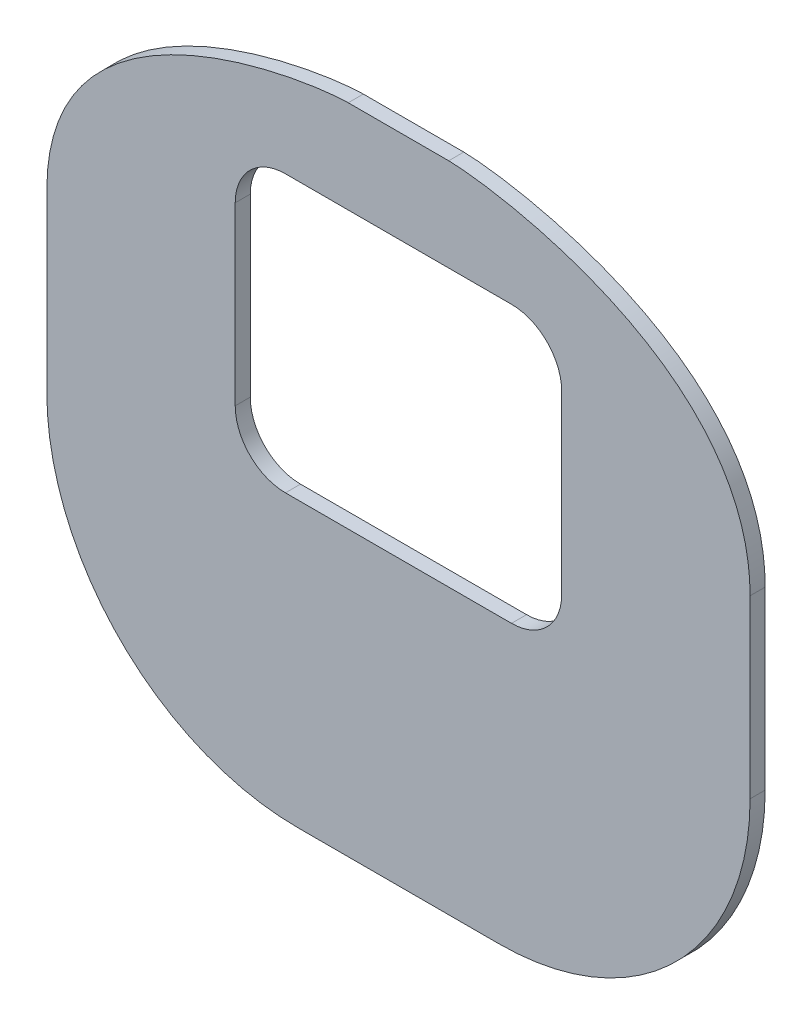
ISO-10303-21;
HEADER;
FILE_DESCRIPTION(('STEP AP214'),'2;1');
FILE_NAME('part.step','',(''),(''),'','','');
FILE_SCHEMA(('AUTOMOTIVE_DESIGN { 1 0 10303 214 1 1 1 1 }'));
ENDSEC;
DATA;
#1=APPLICATION_CONTEXT('core data for automotive mechanical design processes');
#2=APPLICATION_PROTOCOL_DEFINITION('international standard','automotive_design',2000,#1);
#3=PRODUCT_CONTEXT('',#1,'mechanical');
#4=PRODUCT('Part','Part','',(#3));
#5=PRODUCT_RELATED_PRODUCT_CATEGORY('part','',(#4));
#6=PRODUCT_DEFINITION_FORMATION('','',#4);
#7=PRODUCT_DEFINITION_CONTEXT('part definition',#1,'design');
#8=PRODUCT_DEFINITION('design','',#6,#7);
#9=PRODUCT_DEFINITION_SHAPE('','',#8);
#10=(LENGTH_UNIT() NAMED_UNIT(*) SI_UNIT(.MILLI.,.METRE.));
#11=(NAMED_UNIT(*) PLANE_ANGLE_UNIT() SI_UNIT($,.RADIAN.));
#12=(NAMED_UNIT(*) SI_UNIT($,.STERADIAN.) SOLID_ANGLE_UNIT());
#13=UNCERTAINTY_MEASURE_WITH_UNIT(LENGTH_MEASURE(1.E-05),#10,'distance_accuracy_value','');
#14=(GEOMETRIC_REPRESENTATION_CONTEXT(3) GLOBAL_UNCERTAINTY_ASSIGNED_CONTEXT((#13)) GLOBAL_UNIT_ASSIGNED_CONTEXT((#10,
#11,#12)) REPRESENTATION_CONTEXT('',''));
#15=CARTESIAN_POINT('',(0.,0.,0.));
#16=DIRECTION('',(0.,0.,1.));
#17=DIRECTION('',(1.,0.,0.));
#18=AXIS2_PLACEMENT_3D('',#15,#16,#17);
#19=CARTESIAN_POINT('',(9.99999999999999,33.5,3.));
#20=CARTESIAN_POINT('',(18.,33.5,3.));
#21=CARTESIAN_POINT('',(70.,26.5,3.));
#22=CARTESIAN_POINT('',(70.,-11.5,3.));
#23=B_SPLINE_CURVE_WITH_KNOTS('',3,(#19,#20,#21,#22),.UNSPECIFIED.,.F.,.F.,(4,4),(0.,1.),.UNSPECIFIED.);
#24=DIRECTION('',(0.,0.,-1.));
#25=VECTOR('',#24,1.);
#26=SURFACE_OF_LINEAR_EXTRUSION('',#23,#25);
#27=CARTESIAN_POINT('',(9.99999999999999,33.5,0.));
#28=CARTESIAN_POINT('',(18.,33.5,0.));
#29=CARTESIAN_POINT('',(70.,26.5,0.));
#30=CARTESIAN_POINT('',(70.,-11.5,0.));
#31=B_SPLINE_CURVE_WITH_KNOTS('',3,(#27,#28,#29,#30),.UNSPECIFIED.,.F.,.F.,(4,4),(0.,1.),.UNSPECIFIED.);
#32=CARTESIAN_POINT('',(9.99999999999999,33.5,0.));
#33=VERTEX_POINT('',#32);
#34=CARTESIAN_POINT('',(70.,-11.5,0.));
#35=VERTEX_POINT('',#34);
#36=EDGE_CURVE('E191',#33,#35,#31,.T.);
#37=ORIENTED_EDGE('',*,*,#36,.F.);
#38=DIRECTION('',(0.,0.,-1.));
#39=VECTOR('',#38,1.);
#40=CARTESIAN_POINT('',(9.99999999999999,33.5,3.));
#41=LINE('',#40,#39);
#42=CARTESIAN_POINT('',(9.99999999999999,33.5,3.));
#43=VERTEX_POINT('',#42);
#44=EDGE_CURVE('E245',#43,#33,#41,.T.);
#45=ORIENTED_EDGE('',*,*,#44,.F.);
#46=CARTESIAN_POINT('',(70.,-11.5,3.));
#47=VERTEX_POINT('',#46);
#48=EDGE_CURVE('E201',#43,#47,#23,.T.);
#49=ORIENTED_EDGE('',*,*,#48,.T.);
#50=DIRECTION('',(0.,0.,-1.));
#51=VECTOR('',#50,1.);
#52=CARTESIAN_POINT('',(70.,-11.5,3.));
#53=LINE('',#52,#51);
#54=EDGE_CURVE('E274',#47,#35,#53,.T.);
#55=ORIENTED_EDGE('',*,*,#54,.T.);
#56=EDGE_LOOP('',(#37,#45,#49,#55));
#57=FACE_BOUND('',#56,.T.);
#58=ADVANCED_FACE('F39',(#57),#26,.T.);
#59=CARTESIAN_POINT('',(0.,33.5,3.));
#60=DIRECTION('',(0.,1.,0.));
#61=DIRECTION('',(-1.,0.,0.));
#62=AXIS2_PLACEMENT_3D('',#59,#60,#61);
#63=PLANE('',#62);
#64=DIRECTION('',(1.,0.,0.));
#65=VECTOR('',#64,1.);
#66=CARTESIAN_POINT('',(0.,33.5,0.));
#67=LINE('',#66,#65);
#68=CARTESIAN_POINT('',(-10.,33.5,0.));
#69=VERTEX_POINT('',#68);
#70=EDGE_CURVE('E241',#69,#33,#67,.T.);
#71=ORIENTED_EDGE('',*,*,#70,.F.);
#72=DIRECTION('',(0.,0.,-1.));
#73=VECTOR('',#72,1.);
#74=CARTESIAN_POINT('',(-10.,33.5,3.));
#75=LINE('',#74,#73);
#76=CARTESIAN_POINT('',(-10.,33.5,3.));
#77=VERTEX_POINT('',#76);
#78=EDGE_CURVE('E243',#77,#69,#75,.T.);
#79=ORIENTED_EDGE('',*,*,#78,.F.);
#80=DIRECTION('',(1.,0.,0.));
#81=VECTOR('',#80,1.);
#82=CARTESIAN_POINT('',(0.,33.5,3.));
#83=LINE('',#82,#81);
#84=EDGE_CURVE('E207',#77,#43,#83,.T.);
#85=ORIENTED_EDGE('',*,*,#84,.T.);
#86=ORIENTED_EDGE('',*,*,#44,.T.);
#87=EDGE_LOOP('',(#71,#79,#85,#86));
#88=FACE_BOUND('',#87,.T.);
#89=ADVANCED_FACE('F230',(#88),#63,.T.);
#90=CARTESIAN_POINT('',(-70.,-11.5,3.));
#91=CARTESIAN_POINT('',(-70.,26.5,3.));
#92=CARTESIAN_POINT('',(-18.,33.5,3.));
#93=CARTESIAN_POINT('',(-10.,33.5,3.));
#94=B_SPLINE_CURVE_WITH_KNOTS('',3,(#90,#91,#92,#93),.UNSPECIFIED.,.F.,.F.,(4,4),(0.,1.),.UNSPECIFIED.);
#95=DIRECTION('',(0.,0.,-1.));
#96=VECTOR('',#95,1.);
#97=SURFACE_OF_LINEAR_EXTRUSION('',#94,#96);
#98=CARTESIAN_POINT('',(-70.,-11.5,0.));
#99=CARTESIAN_POINT('',(-70.,26.5,0.));
#100=CARTESIAN_POINT('',(-18.,33.5,0.));
#101=CARTESIAN_POINT('',(-10.,33.5,0.));
#102=B_SPLINE_CURVE_WITH_KNOTS('',3,(#98,#99,#100,#101),.UNSPECIFIED.,.F.,.F.,(4,4),(0.,1.),.UNSPECIFIED.);
#103=CARTESIAN_POINT('',(-70.,-11.5,0.));
#104=VERTEX_POINT('',#103);
#105=EDGE_CURVE('E249',#104,#69,#102,.T.);
#106=ORIENTED_EDGE('',*,*,#105,.F.);
#107=DIRECTION('',(0.,0.,-1.));
#108=VECTOR('',#107,1.);
#109=CARTESIAN_POINT('',(-70.,-11.5,3.));
#110=LINE('',#109,#108);
#111=CARTESIAN_POINT('',(-70.,-11.5,3.));
#112=VERTEX_POINT('',#111);
#113=EDGE_CURVE('E288',#112,#104,#110,.T.);
#114=ORIENTED_EDGE('',*,*,#113,.F.);
#115=EDGE_CURVE('E214',#112,#77,#94,.T.);
#116=ORIENTED_EDGE('',*,*,#115,.T.);
#117=ORIENTED_EDGE('',*,*,#78,.T.);
#118=EDGE_LOOP('',(#106,#114,#116,#117));
#119=FACE_BOUND('',#118,.T.);
#120=ADVANCED_FACE('F226',(#119),#97,.T.);
#121=CARTESIAN_POINT('',(-70.,0.,3.));
#122=DIRECTION('',(1.,0.,0.));
#123=DIRECTION('',(0.,1.,0.));
#124=AXIS2_PLACEMENT_3D('',#121,#122,#123);
#125=PLANE('',#124);
#126=DIRECTION('',(0.,-1.,0.));
#127=VECTOR('',#126,1.);
#128=CARTESIAN_POINT('',(-70.,0.,0.));
#129=LINE('',#128,#127);
#130=CARTESIAN_POINT('',(-70.,-46.5,0.));
#131=VERTEX_POINT('',#130);
#132=EDGE_CURVE('E255',#104,#131,#129,.T.);
#133=ORIENTED_EDGE('',*,*,#132,.T.);
#134=DIRECTION('',(0.,0.,-1.));
#135=VECTOR('',#134,1.);
#136=CARTESIAN_POINT('',(-70.,-46.5,3.));
#137=LINE('',#136,#135);
#138=CARTESIAN_POINT('',(-70.,-46.5,3.));
#139=VERTEX_POINT('',#138);
#140=EDGE_CURVE('E285',#139,#131,#137,.T.);
#141=ORIENTED_EDGE('',*,*,#140,.F.);
#142=DIRECTION('',(0.,-1.,0.));
#143=VECTOR('',#142,1.);
#144=CARTESIAN_POINT('',(-70.,0.,3.));
#145=LINE('',#144,#143);
#146=EDGE_CURVE('E220',#112,#139,#145,.T.);
#147=ORIENTED_EDGE('',*,*,#146,.F.);
#148=ORIENTED_EDGE('',*,*,#113,.T.);
#149=EDGE_LOOP('',(#133,#141,#147,#148));
#150=FACE_BOUND('',#149,.T.);
#151=ADVANCED_FACE('F229',(#150),#125,.F.);
#152=CARTESIAN_POINT('',(-20.,-46.5,3.));
#153=DIRECTION('',(0.,0.,-1.));
#154=DIRECTION('',(-1.,0.,0.));
#155=AXIS2_PLACEMENT_3D('',#152,#153,#154);
#156=CYLINDRICAL_SURFACE('',#155,50.);
#157=CARTESIAN_POINT('',(-20.,-46.5,0.));
#158=DIRECTION('',(0.,0.,1.));
#159=DIRECTION('',(1.,0.,0.));
#160=AXIS2_PLACEMENT_3D('',#157,#158,#159);
#161=CIRCLE('',#160,50.);
#162=CARTESIAN_POINT('',(-20.,-96.5,0.));
#163=VERTEX_POINT('',#162);
#164=EDGE_CURVE('E257',#131,#163,#161,.T.);
#165=ORIENTED_EDGE('',*,*,#164,.T.);
#166=DIRECTION('',(0.,0.,-1.));
#167=VECTOR('',#166,1.);
#168=CARTESIAN_POINT('',(-20.,-96.5,3.));
#169=LINE('',#168,#167);
#170=CARTESIAN_POINT('',(-20.,-96.5,3.));
#171=VERTEX_POINT('',#170);
#172=EDGE_CURVE('E282',#171,#163,#169,.T.);
#173=ORIENTED_EDGE('',*,*,#172,.F.);
#174=CARTESIAN_POINT('',(-20.,-46.5,3.));
#175=DIRECTION('',(0.,0.,1.));
#176=DIRECTION('',(1.,0.,0.));
#177=AXIS2_PLACEMENT_3D('',#174,#175,#176);
#178=CIRCLE('',#177,50.);
#179=EDGE_CURVE('E374',#139,#171,#178,.T.);
#180=ORIENTED_EDGE('',*,*,#179,.F.);
#181=ORIENTED_EDGE('',*,*,#140,.T.);
#182=EDGE_LOOP('',(#165,#173,#180,#181));
#183=FACE_BOUND('',#182,.T.);
#184=ADVANCED_FACE('F350',(#183),#156,.T.);
#185=CARTESIAN_POINT('',(0.,-96.5,3.));
#186=DIRECTION('',(0.,1.,0.));
#187=DIRECTION('',(0.,0.,1.));
#188=AXIS2_PLACEMENT_3D('',#185,#186,#187);
#189=PLANE('',#188);
#190=DIRECTION('',(1.,0.,0.));
#191=VECTOR('',#190,1.);
#192=CARTESIAN_POINT('',(0.,-96.5,0.));
#193=LINE('',#192,#191);
#194=CARTESIAN_POINT('',(20.,-96.5,0.));
#195=VERTEX_POINT('',#194);
#196=EDGE_CURVE('E267',#163,#195,#193,.T.);
#197=ORIENTED_EDGE('',*,*,#196,.T.);
#198=DIRECTION('',(0.,0.,-1.));
#199=VECTOR('',#198,1.);
#200=CARTESIAN_POINT('',(20.,-96.5,3.));
#201=LINE('',#200,#199);
#202=CARTESIAN_POINT('',(20.,-96.5,3.));
#203=VERTEX_POINT('',#202);
#204=EDGE_CURVE('E279',#203,#195,#201,.T.);
#205=ORIENTED_EDGE('',*,*,#204,.F.);
#206=DIRECTION('',(1.,0.,0.));
#207=VECTOR('',#206,1.);
#208=CARTESIAN_POINT('',(0.,-96.5,3.));
#209=LINE('',#208,#207);
#210=EDGE_CURVE('E364',#171,#203,#209,.T.);
#211=ORIENTED_EDGE('',*,*,#210,.F.);
#212=ORIENTED_EDGE('',*,*,#172,.T.);
#213=EDGE_LOOP('',(#197,#205,#211,#212));
#214=FACE_BOUND('',#213,.T.);
#215=ADVANCED_FACE('F347',(#214),#189,.F.);
#216=CARTESIAN_POINT('',(20.,-46.5,3.));
#217=DIRECTION('',(0.,0.,-1.));
#218=DIRECTION('',(-1.,0.,0.));
#219=AXIS2_PLACEMENT_3D('',#216,#217,#218);
#220=CYLINDRICAL_SURFACE('',#219,50.);
#221=CARTESIAN_POINT('',(20.,-46.5,0.));
#222=DIRECTION('',(0.,0.,1.));
#223=DIRECTION('',(1.,0.,0.));
#224=AXIS2_PLACEMENT_3D('',#221,#222,#223);
#225=CIRCLE('',#224,50.);
#226=CARTESIAN_POINT('',(70.,-46.5,0.));
#227=VERTEX_POINT('',#226);
#228=EDGE_CURVE('E269',#195,#227,#225,.T.);
#229=ORIENTED_EDGE('',*,*,#228,.T.);
#230=DIRECTION('',(0.,0.,-1.));
#231=VECTOR('',#230,1.);
#232=CARTESIAN_POINT('',(70.,-46.5,3.));
#233=LINE('',#232,#231);
#234=CARTESIAN_POINT('',(70.,-46.5,3.));
#235=VERTEX_POINT('',#234);
#236=EDGE_CURVE('E276',#235,#227,#233,.T.);
#237=ORIENTED_EDGE('',*,*,#236,.F.);
#238=CARTESIAN_POINT('',(20.,-46.5,3.));
#239=DIRECTION('',(0.,0.,1.));
#240=DIRECTION('',(1.,0.,0.));
#241=AXIS2_PLACEMENT_3D('',#238,#239,#240);
#242=CIRCLE('',#241,50.);
#243=EDGE_CURVE('E370',#203,#235,#242,.T.);
#244=ORIENTED_EDGE('',*,*,#243,.F.);
#245=ORIENTED_EDGE('',*,*,#204,.T.);
#246=EDGE_LOOP('',(#229,#237,#244,#245));
#247=FACE_BOUND('',#246,.T.);
#248=ADVANCED_FACE('F343',(#247),#220,.T.);
#249=CARTESIAN_POINT('',(70.,0.,3.));
#250=DIRECTION('',(1.,0.,0.));
#251=DIRECTION('',(0.,1.,0.));
#252=AXIS2_PLACEMENT_3D('',#249,#250,#251);
#253=PLANE('',#252);
#254=DIRECTION('',(0.,-1.,0.));
#255=VECTOR('',#254,1.);
#256=CARTESIAN_POINT('',(70.,0.,0.));
#257=LINE('',#256,#255);
#258=EDGE_CURVE('E208',#35,#227,#257,.T.);
#259=ORIENTED_EDGE('',*,*,#258,.F.);
#260=ORIENTED_EDGE('',*,*,#54,.F.);
#261=DIRECTION('',(0.,-1.,0.));
#262=VECTOR('',#261,1.);
#263=CARTESIAN_POINT('',(70.,0.,3.));
#264=LINE('',#263,#262);
#265=EDGE_CURVE('E277',#47,#235,#264,.T.);
#266=ORIENTED_EDGE('',*,*,#265,.T.);
#267=ORIENTED_EDGE('',*,*,#236,.T.);
#268=EDGE_LOOP('',(#259,#260,#266,#267));
#269=FACE_BOUND('',#268,.T.);
#270=ADVANCED_FACE('F339',(#269),#253,.T.);
#271=CARTESIAN_POINT('',(0.,0.,3.));
#272=DIRECTION('',(0.,0.,1.));
#273=DIRECTION('',(1.,0.,0.));
#274=AXIS2_PLACEMENT_3D('',#271,#272,#273);
#275=PLANE('',#274);
#276=CARTESIAN_POINT('',(-22.5,-30.,3.));
#277=DIRECTION('',(0.,0.,1.));
#278=DIRECTION('',(-1.,0.,0.));
#279=AXIS2_PLACEMENT_3D('',#276,#277,#278);
#280=CIRCLE('',#279,10.);
#281=CARTESIAN_POINT('',(-32.5,-30.,3.));
#282=VERTEX_POINT('',#281);
#283=CARTESIAN_POINT('',(-22.5,-40.,3.));
#284=VERTEX_POINT('',#283);
#285=EDGE_CURVE('E54',#282,#284,#280,.T.);
#286=ORIENTED_EDGE('',*,*,#285,.F.);
#287=DIRECTION('',(0.,-1.,0.));
#288=VECTOR('',#287,1.);
#289=CARTESIAN_POINT('',(-32.5,-30.,3.));
#290=LINE('',#289,#288);
#291=CARTESIAN_POINT('',(-32.5,5.,3.));
#292=VERTEX_POINT('',#291);
#293=EDGE_CURVE('E186',#292,#282,#290,.T.);
#294=ORIENTED_EDGE('',*,*,#293,.F.);
#295=CARTESIAN_POINT('',(-22.5,5.,3.));
#296=DIRECTION('',(0.,0.,1.));
#297=DIRECTION('',(-1.,0.,0.));
#298=AXIS2_PLACEMENT_3D('',#295,#296,#297);
#299=CIRCLE('',#298,10.);
#300=CARTESIAN_POINT('',(-22.5,15.,3.));
#301=VERTEX_POINT('',#300);
#302=EDGE_CURVE('E183',#301,#292,#299,.T.);
#303=ORIENTED_EDGE('',*,*,#302,.F.);
#304=DIRECTION('',(-1.,0.,0.));
#305=VECTOR('',#304,1.);
#306=CARTESIAN_POINT('',(-22.5,15.,3.));
#307=LINE('',#306,#305);
#308=CARTESIAN_POINT('',(22.5,15.,3.));
#309=VERTEX_POINT('',#308);
#310=EDGE_CURVE('E180',#309,#301,#307,.T.);
#311=ORIENTED_EDGE('',*,*,#310,.F.);
#312=CARTESIAN_POINT('',(22.5,5.00000000000002,3.));
#313=DIRECTION('',(0.,0.,1.));
#314=DIRECTION('',(-1.,0.,0.));
#315=AXIS2_PLACEMENT_3D('',#312,#313,#314);
#316=CIRCLE('',#315,10.);
#317=CARTESIAN_POINT('',(32.5,5.00000000000002,3.));
#318=VERTEX_POINT('',#317);
#319=EDGE_CURVE('E174',#318,#309,#316,.T.);
#320=ORIENTED_EDGE('',*,*,#319,.F.);
#321=DIRECTION('',(0.,1.,0.));
#322=VECTOR('',#321,1.);
#323=CARTESIAN_POINT('',(32.5,-30.,3.));
#324=LINE('',#323,#322);
#325=CARTESIAN_POINT('',(32.5,-30.,3.));
#326=VERTEX_POINT('',#325);
#327=EDGE_CURVE('E172',#326,#318,#324,.T.);
#328=ORIENTED_EDGE('',*,*,#327,.F.);
#329=CARTESIAN_POINT('',(22.5,-30.,3.));
#330=DIRECTION('',(0.,0.,1.));
#331=DIRECTION('',(1.,0.,0.));
#332=AXIS2_PLACEMENT_3D('',#329,#330,#331);
#333=CIRCLE('',#332,10.);
#334=CARTESIAN_POINT('',(22.5,-40.,3.));
#335=VERTEX_POINT('',#334);
#336=EDGE_CURVE('E155',#335,#326,#333,.T.);
#337=ORIENTED_EDGE('',*,*,#336,.F.);
#338=DIRECTION('',(1.,0.,0.));
#339=VECTOR('',#338,1.);
#340=CARTESIAN_POINT('',(-22.5,-40.,3.));
#341=LINE('',#340,#339);
#342=EDGE_CURVE('E164',#284,#335,#341,.T.);
#343=ORIENTED_EDGE('',*,*,#342,.F.);
#344=EDGE_LOOP('',(#286,#294,#303,#311,#320,#328,#337,#343));
#345=FACE_BOUND('',#344,.T.);
#346=ORIENTED_EDGE('',*,*,#48,.F.);
#347=ORIENTED_EDGE('',*,*,#84,.F.);
#348=ORIENTED_EDGE('',*,*,#115,.F.);
#349=ORIENTED_EDGE('',*,*,#146,.T.);
#350=ORIENTED_EDGE('',*,*,#179,.T.);
#351=ORIENTED_EDGE('',*,*,#210,.T.);
#352=ORIENTED_EDGE('',*,*,#243,.T.);
#353=ORIENTED_EDGE('',*,*,#265,.F.);
#354=EDGE_LOOP('',(#346,#347,#348,#349,#350,#351,#352,#353));
#355=FACE_BOUND('',#354,.T.);
#356=ADVANCED_FACE('F168',(#345,#355),#275,.T.);
#357=CARTESIAN_POINT('',(0.,0.,0.));
#358=DIRECTION('',(0.,0.,1.));
#359=DIRECTION('',(1.,0.,0.));
#360=AXIS2_PLACEMENT_3D('',#357,#358,#359);
#361=PLANE('',#360);
#362=DIRECTION('',(0.,-1.,0.));
#363=VECTOR('',#362,1.);
#364=CARTESIAN_POINT('',(-32.5,0.,0.));
#365=LINE('',#364,#363);
#366=CARTESIAN_POINT('',(-32.5,5.,0.));
#367=VERTEX_POINT('',#366);
#368=CARTESIAN_POINT('',(-32.5,-30.,0.));
#369=VERTEX_POINT('',#368);
#370=EDGE_CURVE('E47',#367,#369,#365,.T.);
#371=ORIENTED_EDGE('',*,*,#370,.T.);
#372=CARTESIAN_POINT('',(-22.5,-30.,0.));
#373=DIRECTION('',(0.,0.,1.));
#374=DIRECTION('',(1.,0.,0.));
#375=AXIS2_PLACEMENT_3D('',#372,#373,#374);
#376=CIRCLE('',#375,10.);
#377=CARTESIAN_POINT('',(-22.5,-40.,0.));
#378=VERTEX_POINT('',#377);
#379=EDGE_CURVE('E11',#369,#378,#376,.T.);
#380=ORIENTED_EDGE('',*,*,#379,.T.);
#381=DIRECTION('',(1.,0.,0.));
#382=VECTOR('',#381,1.);
#383=CARTESIAN_POINT('',(0.,-40.,0.));
#384=LINE('',#383,#382);
#385=CARTESIAN_POINT('',(22.5,-40.,0.));
#386=VERTEX_POINT('',#385);
#387=EDGE_CURVE('E292',#378,#386,#384,.T.);
#388=ORIENTED_EDGE('',*,*,#387,.T.);
#389=CARTESIAN_POINT('',(22.5,-30.,0.));
#390=DIRECTION('',(0.,0.,1.));
#391=DIRECTION('',(1.,0.,0.));
#392=AXIS2_PLACEMENT_3D('',#389,#390,#391);
#393=CIRCLE('',#392,10.);
#394=CARTESIAN_POINT('',(32.5,-30.,0.));
#395=VERTEX_POINT('',#394);
#396=EDGE_CURVE('E158',#386,#395,#393,.T.);
#397=ORIENTED_EDGE('',*,*,#396,.T.);
#398=DIRECTION('',(0.,1.,0.));
#399=VECTOR('',#398,1.);
#400=CARTESIAN_POINT('',(32.5,0.,0.));
#401=LINE('',#400,#399);
#402=CARTESIAN_POINT('',(32.5,5.00000000000002,0.));
#403=VERTEX_POINT('',#402);
#404=EDGE_CURVE('E295',#395,#403,#401,.T.);
#405=ORIENTED_EDGE('',*,*,#404,.T.);
#406=CARTESIAN_POINT('',(22.5,5.00000000000002,0.));
#407=DIRECTION('',(0.,0.,1.));
#408=DIRECTION('',(1.,0.,0.));
#409=AXIS2_PLACEMENT_3D('',#406,#407,#408);
#410=CIRCLE('',#409,10.);
#411=CARTESIAN_POINT('',(22.5,15.,0.));
#412=VERTEX_POINT('',#411);
#413=EDGE_CURVE('E298',#403,#412,#410,.T.);
#414=ORIENTED_EDGE('',*,*,#413,.T.);
#415=DIRECTION('',(-1.,0.,0.));
#416=VECTOR('',#415,1.);
#417=CARTESIAN_POINT('',(0.,15.,0.));
#418=LINE('',#417,#416);
#419=CARTESIAN_POINT('',(-22.5,15.,0.));
#420=VERTEX_POINT('',#419);
#421=EDGE_CURVE('E301',#412,#420,#418,.T.);
#422=ORIENTED_EDGE('',*,*,#421,.T.);
#423=CARTESIAN_POINT('',(-22.5,5.,0.));
#424=DIRECTION('',(0.,0.,1.));
#425=DIRECTION('',(1.,0.,0.));
#426=AXIS2_PLACEMENT_3D('',#423,#424,#425);
#427=CIRCLE('',#426,10.);
#428=EDGE_CURVE('E304',#420,#367,#427,.T.);
#429=ORIENTED_EDGE('',*,*,#428,.T.);
#430=EDGE_LOOP('',(#371,#380,#388,#397,#405,#414,#422,#429));
#431=FACE_BOUND('',#430,.T.);
#432=ORIENTED_EDGE('',*,*,#36,.T.);
#433=ORIENTED_EDGE('',*,*,#258,.T.);
#434=ORIENTED_EDGE('',*,*,#228,.F.);
#435=ORIENTED_EDGE('',*,*,#196,.F.);
#436=ORIENTED_EDGE('',*,*,#164,.F.);
#437=ORIENTED_EDGE('',*,*,#132,.F.);
#438=ORIENTED_EDGE('',*,*,#105,.T.);
#439=ORIENTED_EDGE('',*,*,#70,.T.);
#440=EDGE_LOOP('',(#432,#433,#434,#435,#436,#437,#438,#439));
#441=FACE_BOUND('',#440,.T.);
#442=ADVANCED_FACE('F253',(#431,#441),#361,.F.);
#443=CARTESIAN_POINT('',(-22.5,-30.,-7.));
#444=DIRECTION('',(0.,0.,1.));
#445=DIRECTION('',(1.,0.,0.));
#446=AXIS2_PLACEMENT_3D('',#443,#444,#445);
#447=CYLINDRICAL_SURFACE('',#446,10.);
#448=DIRECTION('',(0.,0.,1.));
#449=VECTOR('',#448,1.);
#450=CARTESIAN_POINT('',(-32.5,-30.,-7.));
#451=LINE('',#450,#449);
#452=EDGE_CURVE('E189',#369,#282,#451,.T.);
#453=ORIENTED_EDGE('',*,*,#452,.T.);
#454=ORIENTED_EDGE('',*,*,#285,.T.);
#455=DIRECTION('',(0.,0.,1.));
#456=VECTOR('',#455,1.);
#457=CARTESIAN_POINT('',(-22.5,-40.,-7.));
#458=LINE('',#457,#456);
#459=EDGE_CURVE('E161',#378,#284,#458,.T.);
#460=ORIENTED_EDGE('',*,*,#459,.F.);
#461=ORIENTED_EDGE('',*,*,#379,.F.);
#462=EDGE_LOOP('',(#453,#454,#460,#461));
#463=FACE_BOUND('',#462,.T.);
#464=ADVANCED_FACE('F326',(#463),#447,.F.);
#465=CARTESIAN_POINT('',(-32.5,-30.,-7.));
#466=DIRECTION('',(-1.,0.,0.));
#467=DIRECTION('',(0.,0.,1.));
#468=AXIS2_PLACEMENT_3D('',#465,#466,#467);
#469=PLANE('',#468);
#470=DIRECTION('',(0.,0.,1.));
#471=VECTOR('',#470,1.);
#472=CARTESIAN_POINT('',(-32.5,5.,-7.));
#473=LINE('',#472,#471);
#474=EDGE_CURVE('E192',#367,#292,#473,.T.);
#475=ORIENTED_EDGE('',*,*,#474,.T.);
#476=ORIENTED_EDGE('',*,*,#293,.T.);
#477=ORIENTED_EDGE('',*,*,#452,.F.);
#478=ORIENTED_EDGE('',*,*,#370,.F.);
#479=EDGE_LOOP('',(#475,#476,#477,#478));
#480=FACE_BOUND('',#479,.T.);
#481=ADVANCED_FACE('F311',(#480),#469,.F.);
#482=CARTESIAN_POINT('',(-22.5,5.,-7.));
#483=DIRECTION('',(0.,0.,1.));
#484=DIRECTION('',(1.,0.,0.));
#485=AXIS2_PLACEMENT_3D('',#482,#483,#484);
#486=CYLINDRICAL_SURFACE('',#485,10.);
#487=DIRECTION('',(0.,0.,1.));
#488=VECTOR('',#487,1.);
#489=CARTESIAN_POINT('',(-22.5,15.,-7.));
#490=LINE('',#489,#488);
#491=EDGE_CURVE('E194',#420,#301,#490,.T.);
#492=ORIENTED_EDGE('',*,*,#491,.T.);
#493=ORIENTED_EDGE('',*,*,#302,.T.);
#494=ORIENTED_EDGE('',*,*,#474,.F.);
#495=ORIENTED_EDGE('',*,*,#428,.F.);
#496=EDGE_LOOP('',(#492,#493,#494,#495));
#497=FACE_BOUND('',#496,.T.);
#498=ADVANCED_FACE('F313',(#497),#486,.F.);
#499=CARTESIAN_POINT('',(-22.5,15.,-7.));
#500=DIRECTION('',(0.,1.,0.));
#501=DIRECTION('',(-1.,0.,0.));
#502=AXIS2_PLACEMENT_3D('',#499,#500,#501);
#503=PLANE('',#502);
#504=DIRECTION('',(0.,0.,1.));
#505=VECTOR('',#504,1.);
#506=CARTESIAN_POINT('',(22.5,15.,-7.));
#507=LINE('',#506,#505);
#508=EDGE_CURVE('E196',#412,#309,#507,.T.);
#509=ORIENTED_EDGE('',*,*,#508,.T.);
#510=ORIENTED_EDGE('',*,*,#310,.T.);
#511=ORIENTED_EDGE('',*,*,#491,.F.);
#512=ORIENTED_EDGE('',*,*,#421,.F.);
#513=EDGE_LOOP('',(#509,#510,#511,#512));
#514=FACE_BOUND('',#513,.T.);
#515=ADVANCED_FACE('F319',(#514),#503,.F.);
#516=CARTESIAN_POINT('',(22.5,5.00000000000002,-7.));
#517=DIRECTION('',(0.,0.,1.));
#518=DIRECTION('',(1.,0.,0.));
#519=AXIS2_PLACEMENT_3D('',#516,#517,#518);
#520=CYLINDRICAL_SURFACE('',#519,10.);
#521=DIRECTION('',(0.,0.,1.));
#522=VECTOR('',#521,1.);
#523=CARTESIAN_POINT('',(32.5,5.00000000000002,-7.));
#524=LINE('',#523,#522);
#525=EDGE_CURVE('E198',#403,#318,#524,.T.);
#526=ORIENTED_EDGE('',*,*,#525,.T.);
#527=ORIENTED_EDGE('',*,*,#319,.T.);
#528=ORIENTED_EDGE('',*,*,#508,.F.);
#529=ORIENTED_EDGE('',*,*,#413,.F.);
#530=EDGE_LOOP('',(#526,#527,#528,#529));
#531=FACE_BOUND('',#530,.T.);
#532=ADVANCED_FACE('F322',(#531),#520,.F.);
#533=CARTESIAN_POINT('',(32.5,-30.,-7.));
#534=DIRECTION('',(1.,0.,0.));
#535=DIRECTION('',(0.,0.,-1.));
#536=AXIS2_PLACEMENT_3D('',#533,#534,#535);
#537=PLANE('',#536);
#538=DIRECTION('',(0.,0.,1.));
#539=VECTOR('',#538,1.);
#540=CARTESIAN_POINT('',(32.5,-30.,-7.));
#541=LINE('',#540,#539);
#542=EDGE_CURVE('E160',#395,#326,#541,.T.);
#543=ORIENTED_EDGE('',*,*,#542,.T.);
#544=ORIENTED_EDGE('',*,*,#327,.T.);
#545=ORIENTED_EDGE('',*,*,#525,.F.);
#546=ORIENTED_EDGE('',*,*,#404,.F.);
#547=EDGE_LOOP('',(#543,#544,#545,#546));
#548=FACE_BOUND('',#547,.T.);
#549=ADVANCED_FACE('F325',(#548),#537,.F.);
#550=CARTESIAN_POINT('',(22.5,-30.,-7.));
#551=DIRECTION('',(0.,0.,1.));
#552=DIRECTION('',(1.,0.,0.));
#553=AXIS2_PLACEMENT_3D('',#550,#551,#552);
#554=CYLINDRICAL_SURFACE('',#553,10.);
#555=DIRECTION('',(0.,0.,1.));
#556=VECTOR('',#555,1.);
#557=CARTESIAN_POINT('',(22.5,-40.,-7.));
#558=LINE('',#557,#556);
#559=EDGE_CURVE('E62',#386,#335,#558,.T.);
#560=ORIENTED_EDGE('',*,*,#559,.T.);
#561=ORIENTED_EDGE('',*,*,#336,.T.);
#562=ORIENTED_EDGE('',*,*,#542,.F.);
#563=ORIENTED_EDGE('',*,*,#396,.F.);
#564=EDGE_LOOP('',(#560,#561,#562,#563));
#565=FACE_BOUND('',#564,.T.);
#566=ADVANCED_FACE('F152',(#565),#554,.F.);
#567=CARTESIAN_POINT('',(-22.5,-40.,-7.));
#568=DIRECTION('',(0.,-1.,0.));
#569=DIRECTION('',(0.,0.,-1.));
#570=AXIS2_PLACEMENT_3D('',#567,#568,#569);
#571=PLANE('',#570);
#572=ORIENTED_EDGE('',*,*,#459,.T.);
#573=ORIENTED_EDGE('',*,*,#342,.T.);
#574=ORIENTED_EDGE('',*,*,#559,.F.);
#575=ORIENTED_EDGE('',*,*,#387,.F.);
#576=EDGE_LOOP('',(#572,#573,#574,#575));
#577=FACE_BOUND('',#576,.T.);
#578=ADVANCED_FACE('F165',(#577),#571,.F.);
#579=CLOSED_SHELL('',(#58,#89,#120,#151,#184,#215,#248,#270,#356,#442,#464,#481,#498,#515,#532,
#549,#566,#578));
#580=MANIFOLD_SOLID_BREP('B2',#579);
#581=ADVANCED_BREP_SHAPE_REPRESENTATION('',(#18,#580),#14);
#582=SHAPE_DEFINITION_REPRESENTATION(#9,#581);
ENDSEC;
END-ISO-10303-21;
